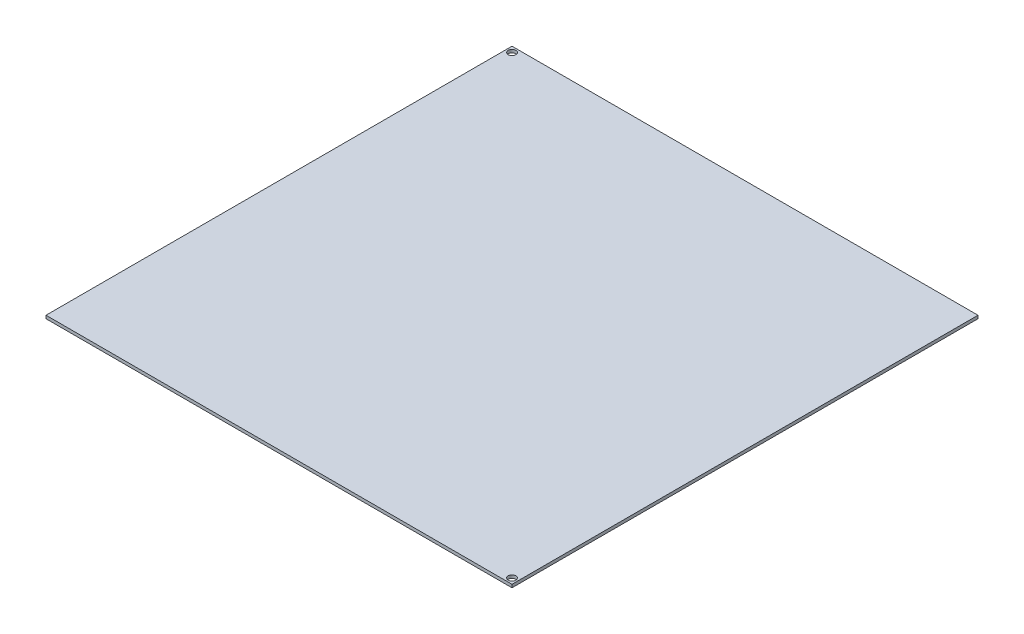
ISO-10303-21;
HEADER;
FILE_DESCRIPTION(('STEP AP214'),'2;1');
FILE_NAME('part.step','',(''),(''),'','','');
FILE_SCHEMA(('AUTOMOTIVE_DESIGN { 1 0 10303 214 1 1 1 1 }'));
ENDSEC;
DATA;
#1=APPLICATION_CONTEXT('core data for automotive mechanical design processes');
#2=APPLICATION_PROTOCOL_DEFINITION('international standard','automotive_design',2000,#1);
#3=PRODUCT_CONTEXT('',#1,'mechanical');
#4=PRODUCT('Part','Part','',(#3));
#5=PRODUCT_RELATED_PRODUCT_CATEGORY('part','',(#4));
#6=PRODUCT_DEFINITION_FORMATION('','',#4);
#7=PRODUCT_DEFINITION_CONTEXT('part definition',#1,'design');
#8=PRODUCT_DEFINITION('design','',#6,#7);
#9=PRODUCT_DEFINITION_SHAPE('','',#8);
#10=(LENGTH_UNIT() NAMED_UNIT(*) SI_UNIT(.MILLI.,.METRE.));
#11=(NAMED_UNIT(*) PLANE_ANGLE_UNIT() SI_UNIT($,.RADIAN.));
#12=(NAMED_UNIT(*) SI_UNIT($,.STERADIAN.) SOLID_ANGLE_UNIT());
#13=UNCERTAINTY_MEASURE_WITH_UNIT(LENGTH_MEASURE(1.E-05),#10,'distance_accuracy_value','');
#14=(GEOMETRIC_REPRESENTATION_CONTEXT(3) GLOBAL_UNCERTAINTY_ASSIGNED_CONTEXT((#13)) GLOBAL_UNIT_ASSIGNED_CONTEXT((#10,
#11,#12)) REPRESENTATION_CONTEXT('',''));
#15=CARTESIAN_POINT('',(0.,0.,0.));
#16=DIRECTION('',(0.,0.,1.));
#17=DIRECTION('',(1.,0.,0.));
#18=AXIS2_PLACEMENT_3D('',#15,#16,#17);
#19=CARTESIAN_POINT('',(0.,1.4,0.));
#20=DIRECTION('',(1.,0.,0.));
#21=DIRECTION('',(0.,0.,-1.));
#22=AXIS2_PLACEMENT_3D('',#19,#20,#21);
#23=PLANE('',#22);
#24=DIRECTION('',(0.,0.,1.));
#25=VECTOR('',#24,1.);
#26=CARTESIAN_POINT('',(0.,0.,0.));
#27=LINE('',#26,#25);
#28=CARTESIAN_POINT('',(0.,0.,-213.));
#29=VERTEX_POINT('',#28);
#30=CARTESIAN_POINT('',(0.,0.,0.));
#31=VERTEX_POINT('',#30);
#32=EDGE_CURVE('E100',#29,#31,#27,.T.);
#33=ORIENTED_EDGE('',*,*,#32,.T.);
#34=DIRECTION('',(0.,-1.,0.));
#35=VECTOR('',#34,1.);
#36=CARTESIAN_POINT('',(0.,1.4,0.));
#37=LINE('',#36,#35);
#38=CARTESIAN_POINT('',(0.,1.4,0.));
#39=VERTEX_POINT('',#38);
#40=EDGE_CURVE('E11',#39,#31,#37,.T.);
#41=ORIENTED_EDGE('',*,*,#40,.F.);
#42=DIRECTION('',(0.,0.,1.));
#43=VECTOR('',#42,1.);
#44=CARTESIAN_POINT('',(0.,1.4,0.));
#45=LINE('',#44,#43);
#46=CARTESIAN_POINT('',(0.,1.4,-213.));
#47=VERTEX_POINT('',#46);
#48=EDGE_CURVE('E88',#47,#39,#45,.T.);
#49=ORIENTED_EDGE('',*,*,#48,.F.);
#50=DIRECTION('',(0.,-1.,0.));
#51=VECTOR('',#50,1.);
#52=CARTESIAN_POINT('',(0.,1.4,-213.));
#53=LINE('',#52,#51);
#54=EDGE_CURVE('E96',#47,#29,#53,.T.);
#55=ORIENTED_EDGE('',*,*,#54,.T.);
#56=EDGE_LOOP('',(#33,#41,#49,#55));
#57=FACE_BOUND('',#56,.T.);
#58=ADVANCED_FACE('F37',(#57),#23,.F.);
#59=CARTESIAN_POINT('',(0.,1.4,0.));
#60=DIRECTION('',(0.,0.,-1.));
#61=DIRECTION('',(-1.,0.,0.));
#62=AXIS2_PLACEMENT_3D('',#59,#60,#61);
#63=PLANE('',#62);
#64=DIRECTION('',(1.,0.,0.));
#65=VECTOR('',#64,1.);
#66=CARTESIAN_POINT('',(0.,0.,0.));
#67=LINE('',#66,#65);
#68=CARTESIAN_POINT('',(213.,0.,0.));
#69=VERTEX_POINT('',#68);
#70=EDGE_CURVE('E92',#31,#69,#67,.T.);
#71=ORIENTED_EDGE('',*,*,#70,.T.);
#72=DIRECTION('',(0.,-1.,0.));
#73=VECTOR('',#72,1.);
#74=CARTESIAN_POINT('',(213.,1.4,0.));
#75=LINE('',#74,#73);
#76=CARTESIAN_POINT('',(213.,1.4,0.));
#77=VERTEX_POINT('',#76);
#78=EDGE_CURVE('E45',#77,#69,#75,.T.);
#79=ORIENTED_EDGE('',*,*,#78,.F.);
#80=DIRECTION('',(1.,0.,0.));
#81=VECTOR('',#80,1.);
#82=CARTESIAN_POINT('',(0.,1.4,0.));
#83=LINE('',#82,#81);
#84=EDGE_CURVE('E83',#39,#77,#83,.T.);
#85=ORIENTED_EDGE('',*,*,#84,.F.);
#86=ORIENTED_EDGE('',*,*,#40,.T.);
#87=EDGE_LOOP('',(#71,#79,#85,#86));
#88=FACE_BOUND('',#87,.T.);
#89=ADVANCED_FACE('F91',(#88),#63,.F.);
#90=CARTESIAN_POINT('',(213.,1.4,0.));
#91=DIRECTION('',(-1.,0.,0.));
#92=DIRECTION('',(0.,0.,1.));
#93=AXIS2_PLACEMENT_3D('',#90,#91,#92);
#94=PLANE('',#93);
#95=DIRECTION('',(0.,0.,-1.));
#96=VECTOR('',#95,1.);
#97=CARTESIAN_POINT('',(213.,0.,0.));
#98=LINE('',#97,#96);
#99=CARTESIAN_POINT('',(213.,0.,-213.));
#100=VERTEX_POINT('',#99);
#101=EDGE_CURVE('E70',#69,#100,#98,.T.);
#102=ORIENTED_EDGE('',*,*,#101,.T.);
#103=DIRECTION('',(0.,-1.,0.));
#104=VECTOR('',#103,1.);
#105=CARTESIAN_POINT('',(213.,1.4,-213.));
#106=LINE('',#105,#104);
#107=CARTESIAN_POINT('',(213.,1.4,-213.));
#108=VERTEX_POINT('',#107);
#109=EDGE_CURVE('E93',#108,#100,#106,.T.);
#110=ORIENTED_EDGE('',*,*,#109,.F.);
#111=DIRECTION('',(0.,0.,-1.));
#112=VECTOR('',#111,1.);
#113=CARTESIAN_POINT('',(213.,1.4,0.));
#114=LINE('',#113,#112);
#115=EDGE_CURVE('E86',#77,#108,#114,.T.);
#116=ORIENTED_EDGE('',*,*,#115,.F.);
#117=ORIENTED_EDGE('',*,*,#78,.T.);
#118=EDGE_LOOP('',(#102,#110,#116,#117));
#119=FACE_BOUND('',#118,.T.);
#120=ADVANCED_FACE('F94',(#119),#94,.F.);
#121=CARTESIAN_POINT('',(0.,1.4,-213.));
#122=DIRECTION('',(0.,0.,1.));
#123=DIRECTION('',(1.,0.,0.));
#124=AXIS2_PLACEMENT_3D('',#121,#122,#123);
#125=PLANE('',#124);
#126=DIRECTION('',(-1.,0.,0.));
#127=VECTOR('',#126,1.);
#128=CARTESIAN_POINT('',(0.,0.,-213.));
#129=LINE('',#128,#127);
#130=EDGE_CURVE('E76',#100,#29,#129,.T.);
#131=ORIENTED_EDGE('',*,*,#130,.T.);
#132=ORIENTED_EDGE('',*,*,#54,.F.);
#133=DIRECTION('',(-1.,0.,0.));
#134=VECTOR('',#133,1.);
#135=CARTESIAN_POINT('',(0.,1.4,-213.));
#136=LINE('',#135,#134);
#137=EDGE_CURVE('E53',#108,#47,#136,.T.);
#138=ORIENTED_EDGE('',*,*,#137,.F.);
#139=ORIENTED_EDGE('',*,*,#109,.T.);
#140=EDGE_LOOP('',(#131,#132,#138,#139));
#141=FACE_BOUND('',#140,.T.);
#142=ADVANCED_FACE('F108',(#141),#125,.F.);
#143=CARTESIAN_POINT('',(0.,1.4,0.));
#144=DIRECTION('',(0.,-1.,0.));
#145=DIRECTION('',(0.,0.,-1.));
#146=AXIS2_PLACEMENT_3D('',#143,#144,#145);
#147=PLANE('',#146);
#148=CARTESIAN_POINT('',(2.49962247149445,1.4,-210.500377528506));
#149=DIRECTION('',(0.,1.,0.));
#150=DIRECTION('',(0.,0.,1.));
#151=AXIS2_PLACEMENT_3D('',#148,#149,#150);
#152=CIRCLE('',#151,1.75);
#153=CARTESIAN_POINT('',(2.49962247149445,1.4,-208.750377528506));
#154=VERTEX_POINT('',#153);
#155=EDGE_CURVE('E120',#154,#154,#152,.T.);
#156=ORIENTED_EDGE('',*,*,#155,.F.);
#157=EDGE_LOOP('',(#156));
#158=FACE_BOUND('',#157,.T.);
#159=CARTESIAN_POINT('',(210.502153225329,1.4,-2.49784677467074));
#160=DIRECTION('',(0.,1.,0.));
#161=DIRECTION('',(0.,0.,1.));
#162=AXIS2_PLACEMENT_3D('',#159,#160,#161);
#163=CIRCLE('',#162,1.75000000000001);
#164=CARTESIAN_POINT('',(210.502153225329,1.4,-0.747846774670725));
#165=VERTEX_POINT('',#164);
#166=EDGE_CURVE('E114',#165,#165,#163,.T.);
#167=ORIENTED_EDGE('',*,*,#166,.F.);
#168=EDGE_LOOP('',(#167));
#169=FACE_BOUND('',#168,.T.);
#170=ORIENTED_EDGE('',*,*,#48,.T.);
#171=ORIENTED_EDGE('',*,*,#84,.T.);
#172=ORIENTED_EDGE('',*,*,#115,.T.);
#173=ORIENTED_EDGE('',*,*,#137,.T.);
#174=EDGE_LOOP('',(#170,#171,#172,#173));
#175=FACE_BOUND('',#174,.T.);
#176=ADVANCED_FACE('F84',(#158,#169,#175),#147,.F.);
#177=CARTESIAN_POINT('',(0.,0.,0.));
#178=DIRECTION('',(0.,-1.,0.));
#179=DIRECTION('',(0.,0.,-1.));
#180=AXIS2_PLACEMENT_3D('',#177,#178,#179);
#181=PLANE('',#180);
#182=CARTESIAN_POINT('',(2.49962247149445,0.,-210.500377528506));
#183=DIRECTION('',(0.,1.,0.));
#184=DIRECTION('',(0.,0.,1.));
#185=AXIS2_PLACEMENT_3D('',#182,#183,#184);
#186=CIRCLE('',#185,1.75);
#187=CARTESIAN_POINT('',(2.49962247149445,0.,-208.750377528506));
#188=VERTEX_POINT('',#187);
#189=EDGE_CURVE('E103',#188,#188,#186,.T.);
#190=ORIENTED_EDGE('',*,*,#189,.T.);
#191=EDGE_LOOP('',(#190));
#192=FACE_BOUND('',#191,.T.);
#193=CARTESIAN_POINT('',(210.502153225329,0.,-2.49784677467074));
#194=DIRECTION('',(0.,1.,0.));
#195=DIRECTION('',(0.,0.,1.));
#196=AXIS2_PLACEMENT_3D('',#193,#194,#195);
#197=CIRCLE('',#196,1.75000000000001);
#198=CARTESIAN_POINT('',(210.502153225329,0.,-0.747846774670725));
#199=VERTEX_POINT('',#198);
#200=EDGE_CURVE('E117',#199,#199,#197,.T.);
#201=ORIENTED_EDGE('',*,*,#200,.T.);
#202=EDGE_LOOP('',(#201));
#203=FACE_BOUND('',#202,.T.);
#204=ORIENTED_EDGE('',*,*,#32,.F.);
#205=ORIENTED_EDGE('',*,*,#130,.F.);
#206=ORIENTED_EDGE('',*,*,#101,.F.);
#207=ORIENTED_EDGE('',*,*,#70,.F.);
#208=EDGE_LOOP('',(#204,#205,#206,#207));
#209=FACE_BOUND('',#208,.T.);
#210=ADVANCED_FACE('F111',(#192,#203,#209),#181,.T.);
#211=CARTESIAN_POINT('',(210.502153225329,0.,-2.49784677467074));
#212=DIRECTION('',(0.,1.,0.));
#213=DIRECTION('',(0.,0.,1.));
#214=AXIS2_PLACEMENT_3D('',#211,#212,#213);
#215=CYLINDRICAL_SURFACE('',#214,1.75000000000001);
#216=ORIENTED_EDGE('',*,*,#200,.F.);
#217=EDGE_LOOP('',(#216));
#218=FACE_BOUND('',#217,.T.);
#219=ORIENTED_EDGE('',*,*,#166,.T.);
#220=EDGE_LOOP('',(#219));
#221=FACE_BOUND('',#220,.T.);
#222=ADVANCED_FACE('F131',(#218,#221),#215,.F.);
#223=CARTESIAN_POINT('',(2.49962247149445,0.,-210.500377528506));
#224=DIRECTION('',(0.,1.,0.));
#225=DIRECTION('',(0.,0.,1.));
#226=AXIS2_PLACEMENT_3D('',#223,#224,#225);
#227=CYLINDRICAL_SURFACE('',#226,1.75);
#228=ORIENTED_EDGE('',*,*,#189,.F.);
#229=EDGE_LOOP('',(#228));
#230=FACE_BOUND('',#229,.T.);
#231=ORIENTED_EDGE('',*,*,#155,.T.);
#232=EDGE_LOOP('',(#231));
#233=FACE_BOUND('',#232,.T.);
#234=ADVANCED_FACE('F128',(#230,#233),#227,.F.);
#235=CLOSED_SHELL('',(#58,#89,#120,#142,#176,#210,#222,#234));
#236=MANIFOLD_SOLID_BREP('B2',#235);
#237=ADVANCED_BREP_SHAPE_REPRESENTATION('',(#18,#236),#14);
#238=SHAPE_DEFINITION_REPRESENTATION(#9,#237);
ENDSEC;
END-ISO-10303-21;
